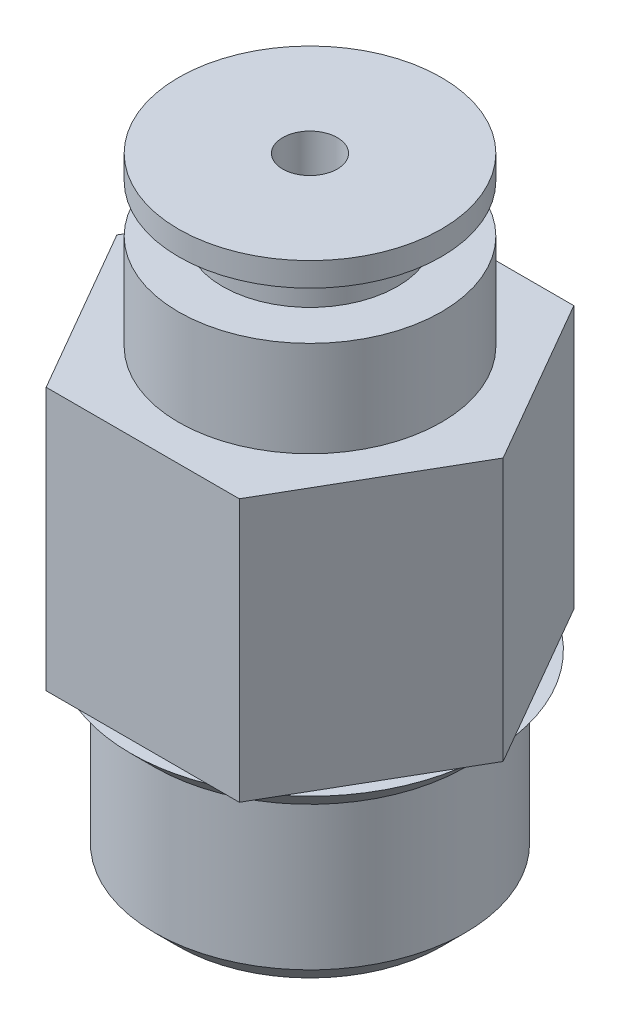
ISO-10303-21;
HEADER;
FILE_DESCRIPTION(('STEP AP214'),'2;1');
FILE_NAME('part.step','',(''),(''),'','','');
FILE_SCHEMA(('AUTOMOTIVE_DESIGN { 1 0 10303 214 1 1 1 1 }'));
ENDSEC;
DATA;
#1=APPLICATION_CONTEXT('core data for automotive mechanical design processes');
#2=APPLICATION_PROTOCOL_DEFINITION('international standard','automotive_design',2000,#1);
#3=PRODUCT_CONTEXT('',#1,'mechanical');
#4=PRODUCT('Part','Part','',(#3));
#5=PRODUCT_RELATED_PRODUCT_CATEGORY('part','',(#4));
#6=PRODUCT_DEFINITION_FORMATION('','',#4);
#7=PRODUCT_DEFINITION_CONTEXT('part definition',#1,'design');
#8=PRODUCT_DEFINITION('design','',#6,#7);
#9=PRODUCT_DEFINITION_SHAPE('','',#8);
#10=(LENGTH_UNIT() NAMED_UNIT(*) SI_UNIT(.MILLI.,.METRE.));
#11=(NAMED_UNIT(*) PLANE_ANGLE_UNIT() SI_UNIT($,.RADIAN.));
#12=(NAMED_UNIT(*) SI_UNIT($,.STERADIAN.) SOLID_ANGLE_UNIT());
#13=UNCERTAINTY_MEASURE_WITH_UNIT(LENGTH_MEASURE(1.E-05),#10,'distance_accuracy_value','');
#14=(GEOMETRIC_REPRESENTATION_CONTEXT(3) GLOBAL_UNCERTAINTY_ASSIGNED_CONTEXT((#13)) GLOBAL_UNIT_ASSIGNED_CONTEXT((#10,
#11,#12)) REPRESENTATION_CONTEXT('',''));
#15=CARTESIAN_POINT('',(0.,0.,0.));
#16=DIRECTION('',(0.,0.,1.));
#17=DIRECTION('',(1.,0.,0.));
#18=AXIS2_PLACEMENT_3D('',#15,#16,#17);
#19=CARTESIAN_POINT('',(0.,19.,0.));
#20=DIRECTION('',(0.,1.,0.));
#21=DIRECTION('',(0.,0.,1.));
#22=AXIS2_PLACEMENT_3D('',#19,#20,#21);
#23=PLANE('',#22);
#24=DIRECTION('',(0.5,0.,-0.866025403784439));
#25=VECTOR('',#24,1.);
#26=CARTESIAN_POINT('',(4.04145188432739,19.,7.));
#27=LINE('',#26,#25);
#28=CARTESIAN_POINT('',(4.04145188432739,19.,7.));
#29=VERTEX_POINT('',#28);
#30=CARTESIAN_POINT('',(8.08290376865476,19.,0.));
#31=VERTEX_POINT('',#30);
#32=EDGE_CURVE('E134',#29,#31,#27,.T.);
#33=ORIENTED_EDGE('',*,*,#32,.T.);
#34=DIRECTION('',(-0.5,0.,-0.866025403784438));
#35=VECTOR('',#34,1.);
#36=CARTESIAN_POINT('',(8.08290376865476,19.,0.));
#37=LINE('',#36,#35);
#38=CARTESIAN_POINT('',(4.04145188432738,19.,-7.));
#39=VERTEX_POINT('',#38);
#40=EDGE_CURVE('E123',#31,#39,#37,.T.);
#41=ORIENTED_EDGE('',*,*,#40,.T.);
#42=DIRECTION('',(-1.,0.,0.));
#43=VECTOR('',#42,1.);
#44=CARTESIAN_POINT('',(4.04145188432738,19.,-7.));
#45=LINE('',#44,#43);
#46=CARTESIAN_POINT('',(-4.04145188432738,19.,-7.));
#47=VERTEX_POINT('',#46);
#48=EDGE_CURVE('E133',#39,#47,#45,.T.);
#49=ORIENTED_EDGE('',*,*,#48,.T.);
#50=DIRECTION('',(-0.5,0.,0.866025403784439));
#51=VECTOR('',#50,1.);
#52=CARTESIAN_POINT('',(-4.04145188432738,19.,-7.));
#53=LINE('',#52,#51);
#54=CARTESIAN_POINT('',(-8.08290376865476,19.,0.));
#55=VERTEX_POINT('',#54);
#56=EDGE_CURVE('E194',#47,#55,#53,.T.);
#57=ORIENTED_EDGE('',*,*,#56,.T.);
#58=DIRECTION('',(0.5,0.,0.866025403784439));
#59=VECTOR('',#58,1.);
#60=CARTESIAN_POINT('',(-8.08290376865476,19.,0.));
#61=LINE('',#60,#59);
#62=CARTESIAN_POINT('',(-4.04145188432738,19.,7.));
#63=VERTEX_POINT('',#62);
#64=EDGE_CURVE('E196',#55,#63,#61,.T.);
#65=ORIENTED_EDGE('',*,*,#64,.T.);
#66=DIRECTION('',(1.,0.,0.));
#67=VECTOR('',#66,1.);
#68=CARTESIAN_POINT('',(-4.04145188432738,19.,7.));
#69=LINE('',#68,#67);
#70=EDGE_CURVE('E139',#63,#29,#69,.T.);
#71=ORIENTED_EDGE('',*,*,#70,.T.);
#72=EDGE_LOOP('',(#33,#41,#49,#57,#65,#71));
#73=FACE_BOUND('',#72,.T.);
#74=CARTESIAN_POINT('',(0.,19.,0.));
#75=DIRECTION('',(0.,1.,0.));
#76=DIRECTION('',(0.,0.,1.));
#77=AXIS2_PLACEMENT_3D('',#74,#75,#76);
#78=CIRCLE('',#77,5.5);
#79=CARTESIAN_POINT('',(0.,19.,5.5));
#80=VERTEX_POINT('',#79);
#81=EDGE_CURVE('E182',#80,#80,#78,.T.);
#82=ORIENTED_EDGE('',*,*,#81,.F.);
#83=EDGE_LOOP('',(#82));
#84=FACE_BOUND('',#83,.T.);
#85=ADVANCED_FACE('F33',(#73,#84),#23,.T.);
#86=CARTESIAN_POINT('',(7.50000000000001,8.,0.));
#87=DIRECTION('',(0.,-1.,0.));
#88=DIRECTION('',(0.,0.,-1.));
#89=AXIS2_PLACEMENT_3D('',#86,#87,#88);
#90=PLANE('',#89);
#91=DIRECTION('',(0.5,0.,-0.866025403784439));
#92=VECTOR('',#91,1.);
#93=CARTESIAN_POINT('',(4.04145188432739,8.,7.));
#94=LINE('',#93,#92);
#95=CARTESIAN_POINT('',(4.71588662470744,8.,5.83184476327223));
#96=VERTEX_POINT('',#95);
#97=CARTESIAN_POINT('',(7.40846902827471,8.,1.16815523672777));
#98=VERTEX_POINT('',#97);
#99=EDGE_CURVE('E171',#96,#98,#94,.T.);
#100=ORIENTED_EDGE('',*,*,#99,.F.);
#101=CARTESIAN_POINT('',(0.,8.,0.));
#102=DIRECTION('',(0.,1.,0.));
#103=DIRECTION('',(0.,0.,1.));
#104=AXIS2_PLACEMENT_3D('',#101,#102,#103);
#105=CIRCLE('',#104,7.50000000000001);
#106=EDGE_CURVE('E164',#96,#98,#105,.T.);
#107=ORIENTED_EDGE('',*,*,#106,.T.);
#108=EDGE_LOOP('',(#100,#107));
#109=FACE_BOUND('',#108,.T.);
#110=ADVANCED_FACE('F292',(#109),#90,.F.);
#111=DIRECTION('',(1.,0.,0.));
#112=VECTOR('',#111,1.);
#113=CARTESIAN_POINT('',(-4.04145188432738,8.,7.));
#114=LINE('',#113,#112);
#115=CARTESIAN_POINT('',(-2.69258240356728,8.,7.));
#116=VERTEX_POINT('',#115);
#117=CARTESIAN_POINT('',(2.69258240356729,8.,7.));
#118=VERTEX_POINT('',#117);
#119=EDGE_CURVE('E47',#116,#118,#114,.T.);
#120=ORIENTED_EDGE('',*,*,#119,.F.);
#121=EDGE_CURVE('E154',#116,#118,#105,.T.);
#122=ORIENTED_EDGE('',*,*,#121,.T.);
#123=EDGE_LOOP('',(#120,#122));
#124=FACE_BOUND('',#123,.T.);
#125=ADVANCED_FACE('F269',(#124),#90,.F.);
#126=DIRECTION('',(0.5,0.,0.866025403784439));
#127=VECTOR('',#126,1.);
#128=CARTESIAN_POINT('',(-8.08290376865476,8.,0.));
#129=LINE('',#128,#127);
#130=CARTESIAN_POINT('',(-7.40846902827471,8.,1.16815523672778));
#131=VERTEX_POINT('',#130);
#132=CARTESIAN_POINT('',(-4.71588662470743,8.,5.83184476327223));
#133=VERTEX_POINT('',#132);
#134=EDGE_CURVE('E176',#131,#133,#129,.T.);
#135=ORIENTED_EDGE('',*,*,#134,.F.);
#136=EDGE_CURVE('E259',#131,#133,#105,.T.);
#137=ORIENTED_EDGE('',*,*,#136,.T.);
#138=EDGE_LOOP('',(#135,#137));
#139=FACE_BOUND('',#138,.T.);
#140=ADVANCED_FACE('F283',(#139),#90,.F.);
#141=DIRECTION('',(-0.5,0.,0.866025403784439));
#142=VECTOR('',#141,1.);
#143=CARTESIAN_POINT('',(-4.04145188432738,8.,-7.));
#144=LINE('',#143,#142);
#145=CARTESIAN_POINT('',(-4.71588662470744,8.,-5.83184476327223));
#146=VERTEX_POINT('',#145);
#147=CARTESIAN_POINT('',(-7.40846902827471,8.,-1.16815523672778));
#148=VERTEX_POINT('',#147);
#149=EDGE_CURVE('E228',#146,#148,#144,.T.);
#150=ORIENTED_EDGE('',*,*,#149,.F.);
#151=EDGE_CURVE('E252',#146,#148,#105,.T.);
#152=ORIENTED_EDGE('',*,*,#151,.T.);
#153=EDGE_LOOP('',(#150,#152));
#154=FACE_BOUND('',#153,.T.);
#155=ADVANCED_FACE('F285',(#154),#90,.F.);
#156=DIRECTION('',(-1.,0.,0.));
#157=VECTOR('',#156,1.);
#158=CARTESIAN_POINT('',(4.04145188432738,8.,-7.));
#159=LINE('',#158,#157);
#160=CARTESIAN_POINT('',(2.69258240356728,8.,-7.));
#161=VERTEX_POINT('',#160);
#162=CARTESIAN_POINT('',(-2.69258240356728,8.,-7.));
#163=VERTEX_POINT('',#162);
#164=EDGE_CURVE('E232',#161,#163,#159,.T.);
#165=ORIENTED_EDGE('',*,*,#164,.F.);
#166=EDGE_CURVE('E248',#161,#163,#105,.T.);
#167=ORIENTED_EDGE('',*,*,#166,.T.);
#168=EDGE_LOOP('',(#165,#167));
#169=FACE_BOUND('',#168,.T.);
#170=ADVANCED_FACE('F291',(#169),#90,.F.);
#171=DIRECTION('',(-0.5,0.,-0.866025403784438));
#172=VECTOR('',#171,1.);
#173=CARTESIAN_POINT('',(8.08290376865476,8.,0.));
#174=LINE('',#173,#172);
#175=CARTESIAN_POINT('',(7.40846902827471,8.,-1.16815523672776));
#176=VERTEX_POINT('',#175);
#177=CARTESIAN_POINT('',(4.71588662470742,8.,-5.83184476327224));
#178=VERTEX_POINT('',#177);
#179=EDGE_CURVE('E169',#176,#178,#174,.T.);
#180=ORIENTED_EDGE('',*,*,#179,.F.);
#181=EDGE_CURVE('E247',#176,#178,#105,.T.);
#182=ORIENTED_EDGE('',*,*,#181,.T.);
#183=EDGE_LOOP('',(#180,#182));
#184=FACE_BOUND('',#183,.T.);
#185=ADVANCED_FACE('F302',(#184),#90,.F.);
#186=CARTESIAN_POINT('',(0.,18.9063425599491,0.));
#187=DIRECTION('',(0.,1.,0.));
#188=DIRECTION('',(0.,0.,1.));
#189=AXIS2_PLACEMENT_3D('',#186,#187,#188);
#190=CYLINDRICAL_SURFACE('',#189,3.27654820765748);
#191=CARTESIAN_POINT('',(0.,0.,0.));
#192=DIRECTION('',(0.,1.,0.));
#193=DIRECTION('',(0.,0.,1.));
#194=AXIS2_PLACEMENT_3D('',#191,#192,#193);
#195=CIRCLE('',#194,3.27654820765748);
#196=CARTESIAN_POINT('',(0.,0.,3.27654820765748));
#197=VERTEX_POINT('',#196);
#198=EDGE_CURVE('E167',#197,#197,#195,.T.);
#199=ORIENTED_EDGE('',*,*,#198,.F.);
#200=EDGE_LOOP('',(#199));
#201=FACE_BOUND('',#200,.T.);
#202=CARTESIAN_POINT('',(0.,8.,0.));
#203=DIRECTION('',(0.,1.,0.));
#204=DIRECTION('',(0.,0.,1.));
#205=AXIS2_PLACEMENT_3D('',#202,#203,#204);
#206=CIRCLE('',#205,3.27654820765748);
#207=CARTESIAN_POINT('',(0.,8.,3.27654820765748));
#208=VERTEX_POINT('',#207);
#209=EDGE_CURVE('E151',#208,#208,#206,.T.);
#210=ORIENTED_EDGE('',*,*,#209,.T.);
#211=EDGE_LOOP('',(#210));
#212=FACE_BOUND('',#211,.T.);
#213=ADVANCED_FACE('F398',(#201,#212),#190,.F.);
#214=CARTESIAN_POINT('',(3.27654820765748,0.,0.));
#215=DIRECTION('',(0.,1.,0.));
#216=DIRECTION('',(0.,0.,1.));
#217=AXIS2_PLACEMENT_3D('',#214,#215,#216);
#218=PLANE('',#217);
#219=CARTESIAN_POINT('',(0.,0.,0.));
#220=DIRECTION('',(0.,1.,0.));
#221=DIRECTION('',(0.,0.,1.));
#222=AXIS2_PLACEMENT_3D('',#219,#220,#221);
#223=CIRCLE('',#222,5.50000000000001);
#224=CARTESIAN_POINT('',(0.,0.,5.50000000000001));
#225=VERTEX_POINT('',#224);
#226=EDGE_CURVE('E11',#225,#225,#223,.F.);
#227=ORIENTED_EDGE('',*,*,#226,.T.);
#228=EDGE_LOOP('',(#227));
#229=FACE_BOUND('',#228,.T.);
#230=ORIENTED_EDGE('',*,*,#198,.T.);
#231=EDGE_LOOP('',(#230));
#232=FACE_BOUND('',#231,.T.);
#233=ADVANCED_FACE('F392',(#229,#232),#218,.F.);
#234=CARTESIAN_POINT('',(0.,18.9063425599491,0.));
#235=DIRECTION('',(0.,1.,0.));
#236=DIRECTION('',(0.,0.,1.));
#237=AXIS2_PLACEMENT_3D('',#234,#235,#236);
#238=CYLINDRICAL_SURFACE('',#237,6.5);
#239=CARTESIAN_POINT('',(0.,0.999999999999994,0.));
#240=DIRECTION('',(0.,1.,0.));
#241=DIRECTION('',(0.,0.,1.));
#242=AXIS2_PLACEMENT_3D('',#239,#240,#241);
#243=CIRCLE('',#242,6.5);
#244=CARTESIAN_POINT('',(0.,0.999999999999994,6.5));
#245=VERTEX_POINT('',#244);
#246=EDGE_CURVE('E41',#245,#245,#243,.T.);
#247=ORIENTED_EDGE('',*,*,#246,.T.);
#248=EDGE_LOOP('',(#247));
#249=FACE_BOUND('',#248,.T.);
#250=CARTESIAN_POINT('',(0.,7.,0.));
#251=DIRECTION('',(0.,1.,0.));
#252=DIRECTION('',(0.,0.,1.));
#253=AXIS2_PLACEMENT_3D('',#250,#251,#252);
#254=CIRCLE('',#253,6.5);
#255=CARTESIAN_POINT('',(0.,7.,6.5));
#256=VERTEX_POINT('',#255);
#257=EDGE_CURVE('E163',#256,#256,#254,.T.);
#258=ORIENTED_EDGE('',*,*,#257,.F.);
#259=EDGE_LOOP('',(#258));
#260=FACE_BOUND('',#259,.T.);
#261=ADVANCED_FACE('F397',(#249,#260),#238,.T.);
#262=CARTESIAN_POINT('',(0.,7.,0.));
#263=DIRECTION('',(0.,1.,0.));
#264=DIRECTION('',(0.,0.,1.));
#265=AXIS2_PLACEMENT_3D('',#262,#263,#264);
#266=CONICAL_SURFACE('',#265,6.5,0.785398163397453);
#267=EDGE_CURVE('E160',#118,#96,#105,.T.);
#268=ORIENTED_EDGE('',*,*,#267,.F.);
#269=ORIENTED_EDGE('',*,*,#121,.F.);
#270=EDGE_CURVE('E54',#133,#116,#105,.T.);
#271=ORIENTED_EDGE('',*,*,#270,.F.);
#272=ORIENTED_EDGE('',*,*,#136,.F.);
#273=EDGE_CURVE('E254',#148,#131,#105,.T.);
#274=ORIENTED_EDGE('',*,*,#273,.F.);
#275=ORIENTED_EDGE('',*,*,#151,.F.);
#276=EDGE_CURVE('E224',#163,#146,#105,.T.);
#277=ORIENTED_EDGE('',*,*,#276,.F.);
#278=ORIENTED_EDGE('',*,*,#166,.F.);
#279=EDGE_CURVE('E244',#178,#161,#105,.T.);
#280=ORIENTED_EDGE('',*,*,#279,.F.);
#281=ORIENTED_EDGE('',*,*,#181,.F.);
#282=EDGE_CURVE('E249',#98,#176,#105,.T.);
#283=ORIENTED_EDGE('',*,*,#282,.F.);
#284=ORIENTED_EDGE('',*,*,#106,.F.);
#285=EDGE_LOOP('',(#268,#269,#271,#272,#274,#275,#277,#278,#280,#281,#283,#284));
#286=FACE_BOUND('',#285,.T.);
#287=ORIENTED_EDGE('',*,*,#257,.T.);
#288=EDGE_LOOP('',(#287));
#289=FACE_BOUND('',#288,.T.);
#290=ADVANCED_FACE('F272',(#286,#289),#266,.T.);
#291=CARTESIAN_POINT('',(-4.04145188432738,19.,7.));
#292=DIRECTION('',(0.,0.,-1.));
#293=DIRECTION('',(-1.,0.,0.));
#294=AXIS2_PLACEMENT_3D('',#291,#292,#293);
#295=PLANE('',#294);
#296=CARTESIAN_POINT('',(-4.04145188432738,8.,7.));
#297=VERTEX_POINT('',#296);
#298=EDGE_CURVE('E143',#297,#116,#114,.T.);
#299=ORIENTED_EDGE('',*,*,#298,.T.);
#300=ORIENTED_EDGE('',*,*,#119,.T.);
#301=CARTESIAN_POINT('',(4.04145188432739,8.,7.));
#302=VERTEX_POINT('',#301);
#303=EDGE_CURVE('E178',#118,#302,#114,.T.);
#304=ORIENTED_EDGE('',*,*,#303,.T.);
#305=DIRECTION('',(0.,-1.,0.));
#306=VECTOR('',#305,1.);
#307=CARTESIAN_POINT('',(4.04145188432739,19.,7.));
#308=LINE('',#307,#306);
#309=EDGE_CURVE('E197',#29,#302,#308,.T.);
#310=ORIENTED_EDGE('',*,*,#309,.F.);
#311=ORIENTED_EDGE('',*,*,#70,.F.);
#312=DIRECTION('',(0.,-1.,0.));
#313=VECTOR('',#312,1.);
#314=CARTESIAN_POINT('',(-4.04145188432738,19.,7.));
#315=LINE('',#314,#313);
#316=EDGE_CURVE('E198',#63,#297,#315,.T.);
#317=ORIENTED_EDGE('',*,*,#316,.T.);
#318=EDGE_LOOP('',(#299,#300,#304,#310,#311,#317));
#319=FACE_BOUND('',#318,.T.);
#320=ADVANCED_FACE('F278',(#319),#295,.F.);
#321=CARTESIAN_POINT('',(-8.08290376865476,19.,0.));
#322=DIRECTION('',(0.866025403784439,0.,-0.5));
#323=DIRECTION('',(-0.5,0.,-0.866025403784438));
#324=AXIS2_PLACEMENT_3D('',#321,#322,#323);
#325=PLANE('',#324);
#326=CARTESIAN_POINT('',(-8.08290376865476,8.,0.));
#327=VERTEX_POINT('',#326);
#328=EDGE_CURVE('E229',#327,#131,#129,.T.);
#329=ORIENTED_EDGE('',*,*,#328,.T.);
#330=ORIENTED_EDGE('',*,*,#134,.T.);
#331=EDGE_CURVE('E225',#133,#297,#129,.T.);
#332=ORIENTED_EDGE('',*,*,#331,.T.);
#333=ORIENTED_EDGE('',*,*,#316,.F.);
#334=ORIENTED_EDGE('',*,*,#64,.F.);
#335=DIRECTION('',(0.,-1.,0.));
#336=VECTOR('',#335,1.);
#337=CARTESIAN_POINT('',(-8.08290376865476,19.,0.));
#338=LINE('',#337,#336);
#339=EDGE_CURVE('E202',#55,#327,#338,.T.);
#340=ORIENTED_EDGE('',*,*,#339,.T.);
#341=EDGE_LOOP('',(#329,#330,#332,#333,#334,#340));
#342=FACE_BOUND('',#341,.T.);
#343=ADVANCED_FACE('F282',(#342),#325,.F.);
#344=CARTESIAN_POINT('',(-4.04145188432738,19.,-7.));
#345=DIRECTION('',(0.866025403784439,0.,0.5));
#346=DIRECTION('',(0.5,0.,-0.866025403784439));
#347=AXIS2_PLACEMENT_3D('',#344,#345,#346);
#348=PLANE('',#347);
#349=CARTESIAN_POINT('',(-4.04145188432738,8.,-7.));
#350=VERTEX_POINT('',#349);
#351=EDGE_CURVE('E215',#350,#146,#144,.T.);
#352=ORIENTED_EDGE('',*,*,#351,.T.);
#353=ORIENTED_EDGE('',*,*,#149,.T.);
#354=EDGE_CURVE('E226',#148,#327,#144,.T.);
#355=ORIENTED_EDGE('',*,*,#354,.T.);
#356=ORIENTED_EDGE('',*,*,#339,.F.);
#357=ORIENTED_EDGE('',*,*,#56,.F.);
#358=DIRECTION('',(0.,-1.,0.));
#359=VECTOR('',#358,1.);
#360=CARTESIAN_POINT('',(-4.04145188432738,19.,-7.));
#361=LINE('',#360,#359);
#362=EDGE_CURVE('E156',#47,#350,#361,.T.);
#363=ORIENTED_EDGE('',*,*,#362,.T.);
#364=EDGE_LOOP('',(#352,#353,#355,#356,#357,#363));
#365=FACE_BOUND('',#364,.T.);
#366=ADVANCED_FACE('F213',(#365),#348,.F.);
#367=CARTESIAN_POINT('',(4.04145188432738,19.,-7.));
#368=DIRECTION('',(0.,0.,1.));
#369=DIRECTION('',(1.,0.,0.));
#370=AXIS2_PLACEMENT_3D('',#367,#368,#369);
#371=PLANE('',#370);
#372=CARTESIAN_POINT('',(4.04145188432738,8.,-7.));
#373=VERTEX_POINT('',#372);
#374=EDGE_CURVE('E230',#373,#161,#159,.T.);
#375=ORIENTED_EDGE('',*,*,#374,.T.);
#376=ORIENTED_EDGE('',*,*,#164,.T.);
#377=EDGE_CURVE('E222',#163,#350,#159,.T.);
#378=ORIENTED_EDGE('',*,*,#377,.T.);
#379=ORIENTED_EDGE('',*,*,#362,.F.);
#380=ORIENTED_EDGE('',*,*,#48,.F.);
#381=DIRECTION('',(0.,-1.,0.));
#382=VECTOR('',#381,1.);
#383=CARTESIAN_POINT('',(4.04145188432738,19.,-7.));
#384=LINE('',#383,#382);
#385=EDGE_CURVE('E130',#39,#373,#384,.T.);
#386=ORIENTED_EDGE('',*,*,#385,.T.);
#387=EDGE_LOOP('',(#375,#376,#378,#379,#380,#386));
#388=FACE_BOUND('',#387,.T.);
#389=ADVANCED_FACE('F241',(#388),#371,.F.);
#390=CARTESIAN_POINT('',(8.08290376865476,19.,0.));
#391=DIRECTION('',(-0.866025403784439,0.,0.5));
#392=DIRECTION('',(0.5,0.,0.866025403784439));
#393=AXIS2_PLACEMENT_3D('',#390,#391,#392);
#394=PLANE('',#393);
#395=CARTESIAN_POINT('',(8.08290376865476,8.,0.));
#396=VERTEX_POINT('',#395);
#397=EDGE_CURVE('E236',#396,#176,#174,.T.);
#398=ORIENTED_EDGE('',*,*,#397,.T.);
#399=ORIENTED_EDGE('',*,*,#179,.T.);
#400=EDGE_CURVE('E181',#178,#373,#174,.T.);
#401=ORIENTED_EDGE('',*,*,#400,.T.);
#402=ORIENTED_EDGE('',*,*,#385,.F.);
#403=ORIENTED_EDGE('',*,*,#40,.F.);
#404=DIRECTION('',(0.,-1.,0.));
#405=VECTOR('',#404,1.);
#406=CARTESIAN_POINT('',(8.08290376865476,19.,0.));
#407=LINE('',#406,#405);
#408=EDGE_CURVE('E128',#31,#396,#407,.T.);
#409=ORIENTED_EDGE('',*,*,#408,.T.);
#410=EDGE_LOOP('',(#398,#399,#401,#402,#403,#409));
#411=FACE_BOUND('',#410,.T.);
#412=ADVANCED_FACE('F126',(#411),#394,.F.);
#413=CARTESIAN_POINT('',(4.04145188432739,19.,7.));
#414=DIRECTION('',(-0.866025403784439,0.,-0.5));
#415=DIRECTION('',(-0.5,0.,0.866025403784439));
#416=AXIS2_PLACEMENT_3D('',#413,#414,#415);
#417=PLANE('',#416);
#418=EDGE_CURVE('E175',#302,#96,#94,.T.);
#419=ORIENTED_EDGE('',*,*,#418,.T.);
#420=ORIENTED_EDGE('',*,*,#99,.T.);
#421=EDGE_CURVE('E149',#98,#396,#94,.T.);
#422=ORIENTED_EDGE('',*,*,#421,.T.);
#423=ORIENTED_EDGE('',*,*,#408,.F.);
#424=ORIENTED_EDGE('',*,*,#32,.F.);
#425=ORIENTED_EDGE('',*,*,#309,.T.);
#426=EDGE_LOOP('',(#419,#420,#422,#423,#424,#425));
#427=FACE_BOUND('',#426,.T.);
#428=ADVANCED_FACE('F146',(#427),#417,.F.);
#429=CARTESIAN_POINT('',(0.,8.,0.));
#430=DIRECTION('',(0.,1.,0.));
#431=DIRECTION('',(0.,0.,1.));
#432=AXIS2_PLACEMENT_3D('',#429,#430,#431);
#433=PLANE('',#432);
#434=ORIENTED_EDGE('',*,*,#331,.F.);
#435=ORIENTED_EDGE('',*,*,#270,.T.);
#436=ORIENTED_EDGE('',*,*,#298,.F.);
#437=EDGE_LOOP('',(#434,#435,#436));
#438=FACE_BOUND('',#437,.T.);
#439=ADVANCED_FACE('F280',(#438),#433,.F.);
#440=ORIENTED_EDGE('',*,*,#354,.F.);
#441=ORIENTED_EDGE('',*,*,#273,.T.);
#442=ORIENTED_EDGE('',*,*,#328,.F.);
#443=EDGE_LOOP('',(#440,#441,#442));
#444=FACE_BOUND('',#443,.T.);
#445=ADVANCED_FACE('F463',(#444),#433,.F.);
#446=ORIENTED_EDGE('',*,*,#377,.F.);
#447=ORIENTED_EDGE('',*,*,#276,.T.);
#448=ORIENTED_EDGE('',*,*,#351,.F.);
#449=EDGE_LOOP('',(#446,#447,#448));
#450=FACE_BOUND('',#449,.T.);
#451=ADVANCED_FACE('F221',(#450),#433,.F.);
#452=ORIENTED_EDGE('',*,*,#400,.F.);
#453=ORIENTED_EDGE('',*,*,#279,.T.);
#454=ORIENTED_EDGE('',*,*,#374,.F.);
#455=EDGE_LOOP('',(#452,#453,#454));
#456=FACE_BOUND('',#455,.T.);
#457=ADVANCED_FACE('F242',(#456),#433,.F.);
#458=ORIENTED_EDGE('',*,*,#421,.F.);
#459=ORIENTED_EDGE('',*,*,#282,.T.);
#460=ORIENTED_EDGE('',*,*,#397,.F.);
#461=EDGE_LOOP('',(#458,#459,#460));
#462=FACE_BOUND('',#461,.T.);
#463=ADVANCED_FACE('F479',(#462),#433,.F.);
#464=ORIENTED_EDGE('',*,*,#303,.F.);
#465=ORIENTED_EDGE('',*,*,#267,.T.);
#466=ORIENTED_EDGE('',*,*,#418,.F.);
#467=EDGE_LOOP('',(#464,#465,#466));
#468=FACE_BOUND('',#467,.T.);
#469=ADVANCED_FACE('F276',(#468),#433,.F.);
#470=ORIENTED_EDGE('',*,*,#209,.F.);
#471=EDGE_LOOP('',(#470));
#472=FACE_BOUND('',#471,.T.);
#473=ADVANCED_FACE('F345',(#472),#433,.F.);
#474=CARTESIAN_POINT('',(0.,22.9251534636519,0.));
#475=DIRECTION('',(0.,1.,0.));
#476=DIRECTION('',(0.,0.,1.));
#477=AXIS2_PLACEMENT_3D('',#474,#475,#476);
#478=CYLINDRICAL_SURFACE('',#477,5.5);
#479=CARTESIAN_POINT('',(0.,23.,0.));
#480=DIRECTION('',(0.,1.,0.));
#481=DIRECTION('',(0.,0.,1.));
#482=AXIS2_PLACEMENT_3D('',#479,#480,#481);
#483=CIRCLE('',#482,5.5);
#484=CARTESIAN_POINT('',(0.,23.,5.5));
#485=VERTEX_POINT('',#484);
#486=EDGE_CURVE('E184',#485,#485,#483,.T.);
#487=ORIENTED_EDGE('',*,*,#486,.F.);
#488=EDGE_LOOP('',(#487));
#489=FACE_BOUND('',#488,.T.);
#490=ORIENTED_EDGE('',*,*,#81,.T.);
#491=EDGE_LOOP('',(#490));
#492=FACE_BOUND('',#491,.T.);
#493=ADVANCED_FACE('F340',(#489,#492),#478,.T.);
#494=CARTESIAN_POINT('',(5.5,23.,0.));
#495=DIRECTION('',(0.,-1.,0.));
#496=DIRECTION('',(0.,0.,-1.));
#497=AXIS2_PLACEMENT_3D('',#494,#495,#496);
#498=PLANE('',#497);
#499=CARTESIAN_POINT('',(0.,23.,0.));
#500=DIRECTION('',(0.,1.,0.));
#501=DIRECTION('',(0.,0.,1.));
#502=AXIS2_PLACEMENT_3D('',#499,#500,#501);
#503=CIRCLE('',#502,3.65793728289857);
#504=CARTESIAN_POINT('',(0.,23.,3.65793728289857));
#505=VERTEX_POINT('',#504);
#506=EDGE_CURVE('E189',#505,#505,#503,.T.);
#507=ORIENTED_EDGE('',*,*,#506,.F.);
#508=EDGE_LOOP('',(#507));
#509=FACE_BOUND('',#508,.T.);
#510=ORIENTED_EDGE('',*,*,#486,.T.);
#511=EDGE_LOOP('',(#510));
#512=FACE_BOUND('',#511,.T.);
#513=ADVANCED_FACE('F337',(#509,#512),#498,.F.);
#514=CARTESIAN_POINT('',(0.,22.9251534636519,0.));
#515=DIRECTION('',(0.,1.,0.));
#516=DIRECTION('',(0.,0.,1.));
#517=AXIS2_PLACEMENT_3D('',#514,#515,#516);
#518=CYLINDRICAL_SURFACE('',#517,3.65793728289857);
#519=CARTESIAN_POINT('',(0.,25.,0.));
#520=DIRECTION('',(0.,1.,0.));
#521=DIRECTION('',(0.,0.,1.));
#522=AXIS2_PLACEMENT_3D('',#519,#520,#521);
#523=CIRCLE('',#522,3.65793728289857);
#524=CARTESIAN_POINT('',(0.,25.,3.65793728289857));
#525=VERTEX_POINT('',#524);
#526=EDGE_CURVE('E330',#525,#525,#523,.T.);
#527=ORIENTED_EDGE('',*,*,#526,.F.);
#528=EDGE_LOOP('',(#527));
#529=FACE_BOUND('',#528,.T.);
#530=ORIENTED_EDGE('',*,*,#506,.T.);
#531=EDGE_LOOP('',(#530));
#532=FACE_BOUND('',#531,.T.);
#533=ADVANCED_FACE('F335',(#529,#532),#518,.T.);
#534=CARTESIAN_POINT('',(3.65793728289857,25.,0.));
#535=DIRECTION('',(0.,1.,0.));
#536=DIRECTION('',(0.,0.,1.));
#537=AXIS2_PLACEMENT_3D('',#534,#535,#536);
#538=PLANE('',#537);
#539=CARTESIAN_POINT('',(0.,25.,0.));
#540=DIRECTION('',(0.,1.,0.));
#541=DIRECTION('',(0.,0.,1.));
#542=AXIS2_PLACEMENT_3D('',#539,#540,#541);
#543=CIRCLE('',#542,5.5);
#544=CARTESIAN_POINT('',(0.,25.,5.5));
#545=VERTEX_POINT('',#544);
#546=EDGE_CURVE('E327',#545,#545,#543,.T.);
#547=ORIENTED_EDGE('',*,*,#546,.F.);
#548=EDGE_LOOP('',(#547));
#549=FACE_BOUND('',#548,.T.);
#550=ORIENTED_EDGE('',*,*,#526,.T.);
#551=EDGE_LOOP('',(#550));
#552=FACE_BOUND('',#551,.T.);
#553=ADVANCED_FACE('F353',(#549,#552),#538,.F.);
#554=CARTESIAN_POINT('',(0.,22.9251534636519,0.));
#555=DIRECTION('',(0.,1.,0.));
#556=DIRECTION('',(0.,0.,1.));
#557=AXIS2_PLACEMENT_3D('',#554,#555,#556);
#558=CYLINDRICAL_SURFACE('',#557,5.5);
#559=CARTESIAN_POINT('',(0.,26.,0.));
#560=DIRECTION('',(0.,1.,0.));
#561=DIRECTION('',(0.,0.,1.));
#562=AXIS2_PLACEMENT_3D('',#559,#560,#561);
#563=CIRCLE('',#562,5.5);
#564=CARTESIAN_POINT('',(0.,26.,5.5));
#565=VERTEX_POINT('',#564);
#566=EDGE_CURVE('E322',#565,#565,#563,.T.);
#567=ORIENTED_EDGE('',*,*,#566,.F.);
#568=EDGE_LOOP('',(#567));
#569=FACE_BOUND('',#568,.T.);
#570=ORIENTED_EDGE('',*,*,#546,.T.);
#571=EDGE_LOOP('',(#570));
#572=FACE_BOUND('',#571,.T.);
#573=ADVANCED_FACE('F357',(#569,#572),#558,.T.);
#574=CARTESIAN_POINT('',(5.5,26.,0.));
#575=DIRECTION('',(0.,-1.,0.));
#576=DIRECTION('',(0.,0.,-1.));
#577=AXIS2_PLACEMENT_3D('',#574,#575,#576);
#578=PLANE('',#577);
#579=CARTESIAN_POINT('',(0.,26.,0.));
#580=DIRECTION('',(0.,1.,0.));
#581=DIRECTION('',(0.,0.,1.));
#582=AXIS2_PLACEMENT_3D('',#579,#580,#581);
#583=CIRCLE('',#582,1.14228307833928);
#584=CARTESIAN_POINT('',(0.,26.,1.14228307833928));
#585=VERTEX_POINT('',#584);
#586=EDGE_CURVE('E319',#585,#585,#583,.T.);
#587=ORIENTED_EDGE('',*,*,#586,.F.);
#588=EDGE_LOOP('',(#587));
#589=FACE_BOUND('',#588,.T.);
#590=ORIENTED_EDGE('',*,*,#566,.T.);
#591=EDGE_LOOP('',(#590));
#592=FACE_BOUND('',#591,.T.);
#593=ADVANCED_FACE('F313',(#589,#592),#578,.F.);
#594=CARTESIAN_POINT('',(0.,22.9251534636519,0.));
#595=DIRECTION('',(0.,1.,0.));
#596=DIRECTION('',(0.,0.,1.));
#597=AXIS2_PLACEMENT_3D('',#594,#595,#596);
#598=CYLINDRICAL_SURFACE('',#597,1.14228307833928);
#599=CARTESIAN_POINT('',(0.,19.,0.));
#600=DIRECTION('',(0.,1.,0.));
#601=DIRECTION('',(0.,0.,1.));
#602=AXIS2_PLACEMENT_3D('',#599,#600,#601);
#603=CIRCLE('',#602,1.14228307833928);
#604=CARTESIAN_POINT('',(0.,19.,1.14228307833928));
#605=VERTEX_POINT('',#604);
#606=EDGE_CURVE('E318',#605,#605,#603,.T.);
#607=ORIENTED_EDGE('',*,*,#606,.F.);
#608=EDGE_LOOP('',(#607));
#609=FACE_BOUND('',#608,.T.);
#610=ORIENTED_EDGE('',*,*,#586,.T.);
#611=EDGE_LOOP('',(#610));
#612=FACE_BOUND('',#611,.T.);
#613=ADVANCED_FACE('F306',(#609,#612),#598,.F.);
#614=ORIENTED_EDGE('',*,*,#606,.T.);
#615=EDGE_LOOP('',(#614));
#616=FACE_BOUND('',#615,.T.);
#617=ADVANCED_FACE('F297',(#616),#23,.T.);
#618=CARTESIAN_POINT('',(0.,0.999999999999994,0.));
#619=DIRECTION('',(0.,1.,0.));
#620=DIRECTION('',(0.,0.,1.));
#621=AXIS2_PLACEMENT_3D('',#618,#619,#620);
#622=CONICAL_SURFACE('',#621,6.5,0.785398163397449);
#623=ORIENTED_EDGE('',*,*,#226,.F.);
#624=EDGE_LOOP('',(#623));
#625=FACE_BOUND('',#624,.T.);
#626=ORIENTED_EDGE('',*,*,#246,.F.);
#627=EDGE_LOOP('',(#626));
#628=FACE_BOUND('',#627,.T.);
#629=ADVANCED_FACE('F35',(#625,#628),#622,.T.);
#630=CLOSED_SHELL('',(#85,#110,#125,#140,#155,#170,#185,#213,#233,#261,#290,#320,#343,#366,#389,
#412,#428,#439,#445,#451,#457,#463,#469,#473,#493,#513,#533,#553,#573,#593,#613,#617,#629));
#631=MANIFOLD_SOLID_BREP('B2',#630);
#632=ADVANCED_BREP_SHAPE_REPRESENTATION('',(#18,#631),#14);
#633=SHAPE_DEFINITION_REPRESENTATION(#9,#632);
ENDSEC;
END-ISO-10303-21;
